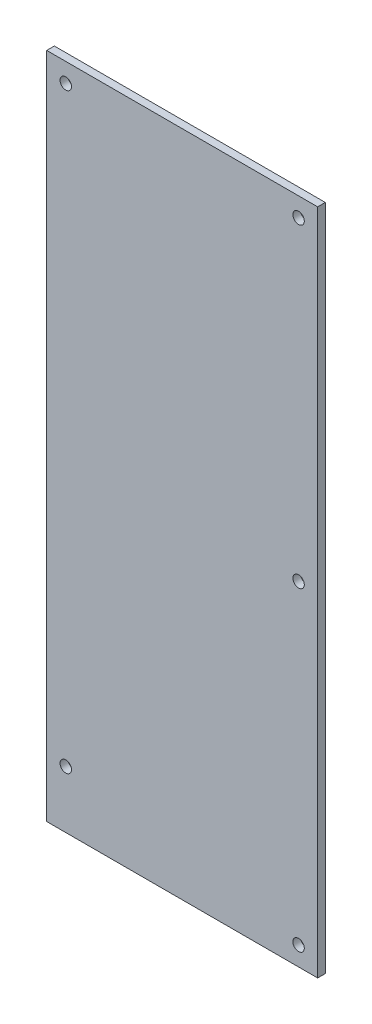
ISO-10303-21;
HEADER;
FILE_DESCRIPTION(('STEP AP214'),'2;1');
FILE_NAME('part.step','',(''),(''),'','','');
FILE_SCHEMA(('AUTOMOTIVE_DESIGN { 1 0 10303 214 1 1 1 1 }'));
ENDSEC;
DATA;
#1=APPLICATION_CONTEXT('core data for automotive mechanical design processes');
#2=APPLICATION_PROTOCOL_DEFINITION('international standard','automotive_design',2000,#1);
#3=PRODUCT_CONTEXT('',#1,'mechanical');
#4=PRODUCT('Part','Part','',(#3));
#5=PRODUCT_RELATED_PRODUCT_CATEGORY('part','',(#4));
#6=PRODUCT_DEFINITION_FORMATION('','',#4);
#7=PRODUCT_DEFINITION_CONTEXT('part definition',#1,'design');
#8=PRODUCT_DEFINITION('design','',#6,#7);
#9=PRODUCT_DEFINITION_SHAPE('','',#8);
#10=(LENGTH_UNIT() NAMED_UNIT(*) SI_UNIT(.MILLI.,.METRE.));
#11=(NAMED_UNIT(*) PLANE_ANGLE_UNIT() SI_UNIT($,.RADIAN.));
#12=(NAMED_UNIT(*) SI_UNIT($,.STERADIAN.) SOLID_ANGLE_UNIT());
#13=UNCERTAINTY_MEASURE_WITH_UNIT(LENGTH_MEASURE(1.E-05),#10,'distance_accuracy_value','');
#14=(GEOMETRIC_REPRESENTATION_CONTEXT(3) GLOBAL_UNCERTAINTY_ASSIGNED_CONTEXT((#13)) GLOBAL_UNIT_ASSIGNED_CONTEXT((#10,
#11,#12)) REPRESENTATION_CONTEXT('',''));
#15=CARTESIAN_POINT('',(0.,0.,0.));
#16=DIRECTION('',(0.,0.,1.));
#17=DIRECTION('',(1.,0.,0.));
#18=AXIS2_PLACEMENT_3D('',#15,#16,#17);
#19=CARTESIAN_POINT('',(0.,0.,4.));
#20=DIRECTION('',(0.,0.,-1.));
#21=DIRECTION('',(-1.,0.,0.));
#22=AXIS2_PLACEMENT_3D('',#19,#20,#21);
#23=PLANE('',#22);
#24=DIRECTION('',(0.,-1.,0.));
#25=VECTOR('',#24,1.);
#26=CARTESIAN_POINT('',(-71.,175.,4.));
#27=LINE('',#26,#25);
#28=CARTESIAN_POINT('',(-71.,175.,4.));
#29=VERTEX_POINT('',#28);
#30=CARTESIAN_POINT('',(-71.,-175.,4.));
#31=VERTEX_POINT('',#30);
#32=EDGE_CURVE('E85',#29,#31,#27,.T.);
#33=ORIENTED_EDGE('',*,*,#32,.T.);
#34=DIRECTION('',(1.,0.,0.));
#35=VECTOR('',#34,1.);
#36=CARTESIAN_POINT('',(71.,-175.,4.));
#37=LINE('',#36,#35);
#38=CARTESIAN_POINT('',(71.,-175.,4.));
#39=VERTEX_POINT('',#38);
#40=EDGE_CURVE('E80',#31,#39,#37,.T.);
#41=ORIENTED_EDGE('',*,*,#40,.T.);
#42=DIRECTION('',(0.,1.,0.));
#43=VECTOR('',#42,1.);
#44=CARTESIAN_POINT('',(71.,175.,4.));
#45=LINE('',#44,#43);
#46=CARTESIAN_POINT('',(71.,175.,4.));
#47=VERTEX_POINT('',#46);
#48=EDGE_CURVE('E83',#39,#47,#45,.T.);
#49=ORIENTED_EDGE('',*,*,#48,.T.);
#50=DIRECTION('',(-1.,0.,0.));
#51=VECTOR('',#50,1.);
#52=CARTESIAN_POINT('',(71.,175.,4.));
#53=LINE('',#52,#51);
#54=EDGE_CURVE('E50',#47,#29,#53,.T.);
#55=ORIENTED_EDGE('',*,*,#54,.T.);
#56=EDGE_LOOP('',(#33,#41,#49,#55));
#57=FACE_BOUND('',#56,.T.);
#58=CARTESIAN_POINT('',(61.,165.,4.));
#59=DIRECTION('',(0.,0.,1.));
#60=DIRECTION('',(1.,0.,0.));
#61=AXIS2_PLACEMENT_3D('',#58,#59,#60);
#62=CIRCLE('',#61,3.00000000000001);
#63=CARTESIAN_POINT('',(64.,165.,4.));
#64=VERTEX_POINT('',#63);
#65=EDGE_CURVE('E100',#64,#64,#62,.T.);
#66=ORIENTED_EDGE('',*,*,#65,.F.);
#67=EDGE_LOOP('',(#66));
#68=FACE_BOUND('',#67,.T.);
#69=CARTESIAN_POINT('',(61.,-165.,4.));
#70=DIRECTION('',(0.,0.,1.));
#71=DIRECTION('',(1.,0.,0.));
#72=AXIS2_PLACEMENT_3D('',#69,#70,#71);
#73=CIRCLE('',#72,3.00000000000001);
#74=CARTESIAN_POINT('',(64.,-165.,4.));
#75=VERTEX_POINT('',#74);
#76=EDGE_CURVE('E115',#75,#75,#73,.T.);
#77=ORIENTED_EDGE('',*,*,#76,.F.);
#78=EDGE_LOOP('',(#77));
#79=FACE_BOUND('',#78,.T.);
#80=CARTESIAN_POINT('',(61.,0.,4.));
#81=DIRECTION('',(0.,0.,1.));
#82=DIRECTION('',(1.,0.,0.));
#83=AXIS2_PLACEMENT_3D('',#80,#81,#82);
#84=CIRCLE('',#83,3.00000000000001);
#85=CARTESIAN_POINT('',(64.,0.,4.));
#86=VERTEX_POINT('',#85);
#87=EDGE_CURVE('E121',#86,#86,#84,.T.);
#88=ORIENTED_EDGE('',*,*,#87,.F.);
#89=EDGE_LOOP('',(#88));
#90=FACE_BOUND('',#89,.T.);
#91=CARTESIAN_POINT('',(-61.,-145.,4.));
#92=DIRECTION('',(0.,0.,1.));
#93=DIRECTION('',(1.,0.,0.));
#94=AXIS2_PLACEMENT_3D('',#91,#92,#93);
#95=CIRCLE('',#94,3.);
#96=CARTESIAN_POINT('',(-58.,-145.,4.));
#97=VERTEX_POINT('',#96);
#98=EDGE_CURVE('E127',#97,#97,#95,.T.);
#99=ORIENTED_EDGE('',*,*,#98,.F.);
#100=EDGE_LOOP('',(#99));
#101=FACE_BOUND('',#100,.T.);
#102=CARTESIAN_POINT('',(-61.,165.,4.));
#103=DIRECTION('',(0.,0.,1.));
#104=DIRECTION('',(1.,0.,0.));
#105=AXIS2_PLACEMENT_3D('',#102,#103,#104);
#106=CIRCLE('',#105,3.);
#107=CARTESIAN_POINT('',(-58.,165.,4.));
#108=VERTEX_POINT('',#107);
#109=EDGE_CURVE('E133',#108,#108,#106,.T.);
#110=ORIENTED_EDGE('',*,*,#109,.F.);
#111=EDGE_LOOP('',(#110));
#112=FACE_BOUND('',#111,.T.);
#113=ADVANCED_FACE('F33',(#57,#68,#79,#90,#101,#112),#23,.F.);
#114=CARTESIAN_POINT('',(0.,0.,0.));
#115=DIRECTION('',(0.,0.,-1.));
#116=DIRECTION('',(-1.,0.,0.));
#117=AXIS2_PLACEMENT_3D('',#114,#115,#116);
#118=PLANE('',#117);
#119=CARTESIAN_POINT('',(-61.,-145.,0.));
#120=DIRECTION('',(0.,0.,1.));
#121=DIRECTION('',(1.,0.,0.));
#122=AXIS2_PLACEMENT_3D('',#119,#120,#121);
#123=CIRCLE('',#122,3.);
#124=CARTESIAN_POINT('',(-58.,-145.,0.));
#125=VERTEX_POINT('',#124);
#126=EDGE_CURVE('E130',#125,#125,#123,.T.);
#127=ORIENTED_EDGE('',*,*,#126,.T.);
#128=EDGE_LOOP('',(#127));
#129=FACE_BOUND('',#128,.T.);
#130=CARTESIAN_POINT('',(61.,-165.,0.));
#131=DIRECTION('',(0.,0.,1.));
#132=DIRECTION('',(1.,0.,0.));
#133=AXIS2_PLACEMENT_3D('',#130,#131,#132);
#134=CIRCLE('',#133,3.00000000000001);
#135=CARTESIAN_POINT('',(64.,-165.,0.));
#136=VERTEX_POINT('',#135);
#137=EDGE_CURVE('E118',#136,#136,#134,.T.);
#138=ORIENTED_EDGE('',*,*,#137,.T.);
#139=EDGE_LOOP('',(#138));
#140=FACE_BOUND('',#139,.T.);
#141=DIRECTION('',(0.,-1.,0.));
#142=VECTOR('',#141,1.);
#143=CARTESIAN_POINT('',(-71.,175.,0.));
#144=LINE('',#143,#142);
#145=CARTESIAN_POINT('',(-71.,175.,0.));
#146=VERTEX_POINT('',#145);
#147=CARTESIAN_POINT('',(-71.,-175.,0.));
#148=VERTEX_POINT('',#147);
#149=EDGE_CURVE('E97',#146,#148,#144,.T.);
#150=ORIENTED_EDGE('',*,*,#149,.F.);
#151=DIRECTION('',(-1.,0.,0.));
#152=VECTOR('',#151,1.);
#153=CARTESIAN_POINT('',(71.,175.,0.));
#154=LINE('',#153,#152);
#155=CARTESIAN_POINT('',(71.,175.,0.));
#156=VERTEX_POINT('',#155);
#157=EDGE_CURVE('E73',#156,#146,#154,.T.);
#158=ORIENTED_EDGE('',*,*,#157,.F.);
#159=DIRECTION('',(0.,1.,0.));
#160=VECTOR('',#159,1.);
#161=CARTESIAN_POINT('',(71.,175.,0.));
#162=LINE('',#161,#160);
#163=CARTESIAN_POINT('',(71.,-175.,0.));
#164=VERTEX_POINT('',#163);
#165=EDGE_CURVE('E67',#164,#156,#162,.T.);
#166=ORIENTED_EDGE('',*,*,#165,.F.);
#167=DIRECTION('',(1.,0.,0.));
#168=VECTOR('',#167,1.);
#169=CARTESIAN_POINT('',(71.,-175.,0.));
#170=LINE('',#169,#168);
#171=EDGE_CURVE('E89',#148,#164,#170,.T.);
#172=ORIENTED_EDGE('',*,*,#171,.F.);
#173=EDGE_LOOP('',(#150,#158,#166,#172));
#174=FACE_BOUND('',#173,.T.);
#175=CARTESIAN_POINT('',(61.,165.,0.));
#176=DIRECTION('',(0.,0.,1.));
#177=DIRECTION('',(1.,0.,0.));
#178=AXIS2_PLACEMENT_3D('',#175,#176,#177);
#179=CIRCLE('',#178,3.00000000000001);
#180=CARTESIAN_POINT('',(64.,165.,0.));
#181=VERTEX_POINT('',#180);
#182=EDGE_CURVE('E112',#181,#181,#179,.T.);
#183=ORIENTED_EDGE('',*,*,#182,.T.);
#184=EDGE_LOOP('',(#183));
#185=FACE_BOUND('',#184,.T.);
#186=CARTESIAN_POINT('',(61.,0.,0.));
#187=DIRECTION('',(0.,0.,1.));
#188=DIRECTION('',(1.,0.,0.));
#189=AXIS2_PLACEMENT_3D('',#186,#187,#188);
#190=CIRCLE('',#189,3.00000000000001);
#191=CARTESIAN_POINT('',(64.,0.,0.));
#192=VERTEX_POINT('',#191);
#193=EDGE_CURVE('E124',#192,#192,#190,.T.);
#194=ORIENTED_EDGE('',*,*,#193,.T.);
#195=EDGE_LOOP('',(#194));
#196=FACE_BOUND('',#195,.T.);
#197=CARTESIAN_POINT('',(-61.,165.,0.));
#198=DIRECTION('',(0.,0.,1.));
#199=DIRECTION('',(1.,0.,0.));
#200=AXIS2_PLACEMENT_3D('',#197,#198,#199);
#201=CIRCLE('',#200,3.);
#202=CARTESIAN_POINT('',(-58.,165.,0.));
#203=VERTEX_POINT('',#202);
#204=EDGE_CURVE('E136',#203,#203,#201,.T.);
#205=ORIENTED_EDGE('',*,*,#204,.T.);
#206=EDGE_LOOP('',(#205));
#207=FACE_BOUND('',#206,.T.);
#208=ADVANCED_FACE('F108',(#129,#140,#174,#185,#196,#207),#118,.T.);
#209=CARTESIAN_POINT('',(-71.,175.,4.));
#210=DIRECTION('',(1.,0.,0.));
#211=DIRECTION('',(0.,1.,0.));
#212=AXIS2_PLACEMENT_3D('',#209,#210,#211);
#213=PLANE('',#212);
#214=ORIENTED_EDGE('',*,*,#149,.T.);
#215=DIRECTION('',(0.,0.,-1.));
#216=VECTOR('',#215,1.);
#217=CARTESIAN_POINT('',(-71.,-175.,4.));
#218=LINE('',#217,#216);
#219=EDGE_CURVE('E11',#31,#148,#218,.T.);
#220=ORIENTED_EDGE('',*,*,#219,.F.);
#221=ORIENTED_EDGE('',*,*,#32,.F.);
#222=DIRECTION('',(0.,0.,-1.));
#223=VECTOR('',#222,1.);
#224=CARTESIAN_POINT('',(-71.,175.,4.));
#225=LINE('',#224,#223);
#226=EDGE_CURVE('E93',#29,#146,#225,.T.);
#227=ORIENTED_EDGE('',*,*,#226,.T.);
#228=EDGE_LOOP('',(#214,#220,#221,#227));
#229=FACE_BOUND('',#228,.T.);
#230=ADVANCED_FACE('F35',(#229),#213,.F.);
#231=CARTESIAN_POINT('',(71.,-175.,4.));
#232=DIRECTION('',(0.,1.,0.));
#233=DIRECTION('',(0.,0.,1.));
#234=AXIS2_PLACEMENT_3D('',#231,#232,#233);
#235=PLANE('',#234);
#236=ORIENTED_EDGE('',*,*,#171,.T.);
#237=DIRECTION('',(0.,0.,-1.));
#238=VECTOR('',#237,1.);
#239=CARTESIAN_POINT('',(71.,-175.,4.));
#240=LINE('',#239,#238);
#241=EDGE_CURVE('E42',#39,#164,#240,.T.);
#242=ORIENTED_EDGE('',*,*,#241,.F.);
#243=ORIENTED_EDGE('',*,*,#40,.F.);
#244=ORIENTED_EDGE('',*,*,#219,.T.);
#245=EDGE_LOOP('',(#236,#242,#243,#244));
#246=FACE_BOUND('',#245,.T.);
#247=ADVANCED_FACE('F88',(#246),#235,.F.);
#248=CARTESIAN_POINT('',(71.,175.,4.));
#249=DIRECTION('',(-1.,0.,0.));
#250=DIRECTION('',(0.,-1.,0.));
#251=AXIS2_PLACEMENT_3D('',#248,#249,#250);
#252=PLANE('',#251);
#253=ORIENTED_EDGE('',*,*,#165,.T.);
#254=DIRECTION('',(0.,0.,-1.));
#255=VECTOR('',#254,1.);
#256=CARTESIAN_POINT('',(71.,175.,4.));
#257=LINE('',#256,#255);
#258=EDGE_CURVE('E90',#47,#156,#257,.T.);
#259=ORIENTED_EDGE('',*,*,#258,.F.);
#260=ORIENTED_EDGE('',*,*,#48,.F.);
#261=ORIENTED_EDGE('',*,*,#241,.T.);
#262=EDGE_LOOP('',(#253,#259,#260,#261));
#263=FACE_BOUND('',#262,.T.);
#264=ADVANCED_FACE('F91',(#263),#252,.F.);
#265=CARTESIAN_POINT('',(71.,175.,4.));
#266=DIRECTION('',(0.,-1.,0.));
#267=DIRECTION('',(1.,0.,0.));
#268=AXIS2_PLACEMENT_3D('',#265,#266,#267);
#269=PLANE('',#268);
#270=ORIENTED_EDGE('',*,*,#157,.T.);
#271=ORIENTED_EDGE('',*,*,#226,.F.);
#272=ORIENTED_EDGE('',*,*,#54,.F.);
#273=ORIENTED_EDGE('',*,*,#258,.T.);
#274=EDGE_LOOP('',(#270,#271,#272,#273));
#275=FACE_BOUND('',#274,.T.);
#276=ADVANCED_FACE('F105',(#275),#269,.F.);
#277=CARTESIAN_POINT('',(61.,165.,4.));
#278=DIRECTION('',(0.,0.,-1.));
#279=DIRECTION('',(-1.,0.,0.));
#280=AXIS2_PLACEMENT_3D('',#277,#278,#279);
#281=CYLINDRICAL_SURFACE('',#280,3.00000000000001);
#282=ORIENTED_EDGE('',*,*,#65,.T.);
#283=EDGE_LOOP('',(#282));
#284=FACE_BOUND('',#283,.T.);
#285=ORIENTED_EDGE('',*,*,#182,.F.);
#286=EDGE_LOOP('',(#285));
#287=FACE_BOUND('',#286,.T.);
#288=ADVANCED_FACE('F153',(#284,#287),#281,.F.);
#289=CARTESIAN_POINT('',(61.,-165.,4.));
#290=DIRECTION('',(0.,0.,-1.));
#291=DIRECTION('',(-1.,0.,0.));
#292=AXIS2_PLACEMENT_3D('',#289,#290,#291);
#293=CYLINDRICAL_SURFACE('',#292,3.00000000000001);
#294=ORIENTED_EDGE('',*,*,#76,.T.);
#295=EDGE_LOOP('',(#294));
#296=FACE_BOUND('',#295,.T.);
#297=ORIENTED_EDGE('',*,*,#137,.F.);
#298=EDGE_LOOP('',(#297));
#299=FACE_BOUND('',#298,.T.);
#300=ADVANCED_FACE('F199',(#296,#299),#293,.F.);
#301=CARTESIAN_POINT('',(61.,0.,4.));
#302=DIRECTION('',(0.,0.,-1.));
#303=DIRECTION('',(-1.,0.,0.));
#304=AXIS2_PLACEMENT_3D('',#301,#302,#303);
#305=CYLINDRICAL_SURFACE('',#304,3.00000000000001);
#306=ORIENTED_EDGE('',*,*,#87,.T.);
#307=EDGE_LOOP('',(#306));
#308=FACE_BOUND('',#307,.T.);
#309=ORIENTED_EDGE('',*,*,#193,.F.);
#310=EDGE_LOOP('',(#309));
#311=FACE_BOUND('',#310,.T.);
#312=ADVANCED_FACE('F207',(#308,#311),#305,.F.);
#313=CARTESIAN_POINT('',(-61.,-145.,4.));
#314=DIRECTION('',(0.,0.,-1.));
#315=DIRECTION('',(-1.,0.,0.));
#316=AXIS2_PLACEMENT_3D('',#313,#314,#315);
#317=CYLINDRICAL_SURFACE('',#316,3.);
#318=ORIENTED_EDGE('',*,*,#98,.T.);
#319=EDGE_LOOP('',(#318));
#320=FACE_BOUND('',#319,.T.);
#321=ORIENTED_EDGE('',*,*,#126,.F.);
#322=EDGE_LOOP('',(#321));
#323=FACE_BOUND('',#322,.T.);
#324=ADVANCED_FACE('F215',(#320,#323),#317,.F.);
#325=CARTESIAN_POINT('',(-61.,165.,4.));
#326=DIRECTION('',(0.,0.,-1.));
#327=DIRECTION('',(-1.,0.,0.));
#328=AXIS2_PLACEMENT_3D('',#325,#326,#327);
#329=CYLINDRICAL_SURFACE('',#328,3.);
#330=ORIENTED_EDGE('',*,*,#109,.T.);
#331=EDGE_LOOP('',(#330));
#332=FACE_BOUND('',#331,.T.);
#333=ORIENTED_EDGE('',*,*,#204,.F.);
#334=EDGE_LOOP('',(#333));
#335=FACE_BOUND('',#334,.T.);
#336=ADVANCED_FACE('F142',(#332,#335),#329,.F.);
#337=CLOSED_SHELL('',(#113,#208,#230,#247,#264,#276,#288,#300,#312,#324,#336));
#338=MANIFOLD_SOLID_BREP('B2',#337);
#339=ADVANCED_BREP_SHAPE_REPRESENTATION('',(#18,#338),#14);
#340=SHAPE_DEFINITION_REPRESENTATION(#9,#339);
ENDSEC;
END-ISO-10303-21;
